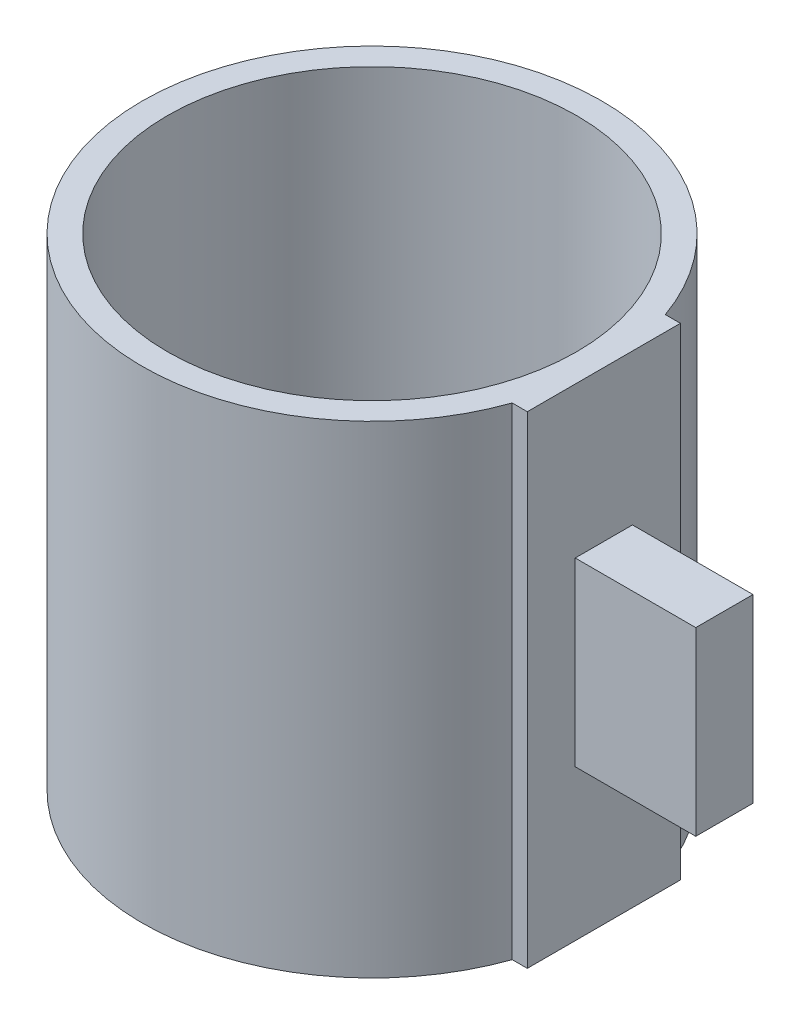
ISO-10303-21;
HEADER;
FILE_DESCRIPTION(('STEP AP214'),'2;1');
FILE_NAME('part.step','',(''),(''),'','','');
FILE_SCHEMA(('AUTOMOTIVE_DESIGN { 1 0 10303 214 1 1 1 1 }'));
ENDSEC;
DATA;
#1=APPLICATION_CONTEXT('core data for automotive mechanical design processes');
#2=APPLICATION_PROTOCOL_DEFINITION('international standard','automotive_design',2000,#1);
#3=PRODUCT_CONTEXT('',#1,'mechanical');
#4=PRODUCT('Part','Part','',(#3));
#5=PRODUCT_RELATED_PRODUCT_CATEGORY('part','',(#4));
#6=PRODUCT_DEFINITION_FORMATION('','',#4);
#7=PRODUCT_DEFINITION_CONTEXT('part definition',#1,'design');
#8=PRODUCT_DEFINITION('design','',#6,#7);
#9=PRODUCT_DEFINITION_SHAPE('','',#8);
#10=(LENGTH_UNIT() NAMED_UNIT(*) SI_UNIT(.MILLI.,.METRE.));
#11=(NAMED_UNIT(*) PLANE_ANGLE_UNIT() SI_UNIT($,.RADIAN.));
#12=(NAMED_UNIT(*) SI_UNIT($,.STERADIAN.) SOLID_ANGLE_UNIT());
#13=UNCERTAINTY_MEASURE_WITH_UNIT(LENGTH_MEASURE(1.E-05),#10,'distance_accuracy_value','');
#14=(GEOMETRIC_REPRESENTATION_CONTEXT(3) GLOBAL_UNCERTAINTY_ASSIGNED_CONTEXT((#13)) GLOBAL_UNIT_ASSIGNED_CONTEXT((#10,
#11,#12)) REPRESENTATION_CONTEXT('',''));
#15=CARTESIAN_POINT('',(0.,0.,0.));
#16=DIRECTION('',(0.,0.,1.));
#17=DIRECTION('',(1.,0.,0.));
#18=AXIS2_PLACEMENT_3D('',#15,#16,#17);
#19=CARTESIAN_POINT('',(38.4634481105469,80.,12.7));
#20=DIRECTION('',(-1.,0.,0.));
#21=DIRECTION('',(0.,0.,1.));
#22=AXIS2_PLACEMENT_3D('',#19,#20,#21);
#23=PLANE('',#22);
#24=DIRECTION('',(0.,0.,-1.));
#25=VECTOR('',#24,1.);
#26=CARTESIAN_POINT('',(38.4634481105469,0.,12.7));
#27=LINE('',#26,#25);
#28=CARTESIAN_POINT('',(38.4634481105469,0.,12.7));
#29=VERTEX_POINT('',#28);
#30=CARTESIAN_POINT('',(38.4634481105469,0.,-12.7));
#31=VERTEX_POINT('',#30);
#32=EDGE_CURVE('E151',#29,#31,#27,.T.);
#33=ORIENTED_EDGE('',*,*,#32,.T.);
#34=DIRECTION('',(0.,-1.,0.));
#35=VECTOR('',#34,1.);
#36=CARTESIAN_POINT('',(38.4634481105469,80.,-12.7));
#37=LINE('',#36,#35);
#38=CARTESIAN_POINT('',(38.4634481105469,80.,-12.7));
#39=VERTEX_POINT('',#38);
#40=EDGE_CURVE('E156',#39,#31,#37,.T.);
#41=ORIENTED_EDGE('',*,*,#40,.F.);
#42=DIRECTION('',(0.,0.,-1.));
#43=VECTOR('',#42,1.);
#44=CARTESIAN_POINT('',(38.4634481105469,80.,12.7));
#45=LINE('',#44,#43);
#46=CARTESIAN_POINT('',(38.4634481105469,80.,12.7));
#47=VERTEX_POINT('',#46);
#48=EDGE_CURVE('E142',#47,#39,#45,.T.);
#49=ORIENTED_EDGE('',*,*,#48,.F.);
#50=DIRECTION('',(0.,-1.,0.));
#51=VECTOR('',#50,1.);
#52=CARTESIAN_POINT('',(38.4634481105469,80.,12.7));
#53=LINE('',#52,#51);
#54=EDGE_CURVE('E47',#47,#29,#53,.T.);
#55=ORIENTED_EDGE('',*,*,#54,.T.);
#56=EDGE_LOOP('',(#33,#41,#49,#55));
#57=FACE_BOUND('',#56,.T.);
#58=DIRECTION('',(0.,1.,0.));
#59=VECTOR('',#58,1.);
#60=CARTESIAN_POINT('',(38.4634481105469,25.,-4.75));
#61=LINE('',#60,#59);
#62=CARTESIAN_POINT('',(38.4634481105469,25.,-4.75));
#63=VERTEX_POINT('',#62);
#64=CARTESIAN_POINT('',(38.4634481105469,55.,-4.75));
#65=VERTEX_POINT('',#64);
#66=EDGE_CURVE('E54',#63,#65,#61,.T.);
#67=ORIENTED_EDGE('',*,*,#66,.F.);
#68=DIRECTION('',(0.,0.,-1.));
#69=VECTOR('',#68,1.);
#70=CARTESIAN_POINT('',(38.4634481105469,25.,4.75));
#71=LINE('',#70,#69);
#72=CARTESIAN_POINT('',(38.4634481105469,25.,4.75));
#73=VERTEX_POINT('',#72);
#74=EDGE_CURVE('E58',#73,#63,#71,.T.);
#75=ORIENTED_EDGE('',*,*,#74,.F.);
#76=DIRECTION('',(0.,-1.,0.));
#77=VECTOR('',#76,1.);
#78=CARTESIAN_POINT('',(38.4634481105469,25.,4.75));
#79=LINE('',#78,#77);
#80=CARTESIAN_POINT('',(38.4634481105469,55.,4.75));
#81=VERTEX_POINT('',#80);
#82=EDGE_CURVE('E284',#81,#73,#79,.T.);
#83=ORIENTED_EDGE('',*,*,#82,.F.);
#84=DIRECTION('',(0.,0.,1.));
#85=VECTOR('',#84,1.);
#86=CARTESIAN_POINT('',(38.4634481105469,55.,4.75));
#87=LINE('',#86,#85);
#88=EDGE_CURVE('E290',#65,#81,#87,.T.);
#89=ORIENTED_EDGE('',*,*,#88,.F.);
#90=EDGE_LOOP('',(#67,#75,#83,#89));
#91=FACE_BOUND('',#90,.T.);
#92=ADVANCED_FACE('F39',(#57,#91),#23,.F.);
#93=CARTESIAN_POINT('',(0.,80.,0.));
#94=DIRECTION('',(0.,1.,0.));
#95=DIRECTION('',(0.,0.,1.));
#96=AXIS2_PLACEMENT_3D('',#93,#94,#95);
#97=PLANE('',#96);
#98=CARTESIAN_POINT('',(0.,80.,0.));
#99=DIRECTION('',(0.,1.,0.));
#100=DIRECTION('',(0.,0.,1.));
#101=AXIS2_PLACEMENT_3D('',#98,#99,#100);
#102=CIRCLE('',#101,38.14);
#103=CARTESIAN_POINT('',(35.9634481105469,80.,-12.7));
#104=VERTEX_POINT('',#103);
#105=CARTESIAN_POINT('',(35.9634481105469,80.,12.7));
#106=VERTEX_POINT('',#105);
#107=EDGE_CURVE('E136',#104,#106,#102,.T.);
#108=ORIENTED_EDGE('',*,*,#107,.T.);
#109=DIRECTION('',(1.,0.,0.));
#110=VECTOR('',#109,1.);
#111=CARTESIAN_POINT('',(35.9634481105469,80.,12.7));
#112=LINE('',#111,#110);
#113=EDGE_CURVE('E139',#106,#47,#112,.T.);
#114=ORIENTED_EDGE('',*,*,#113,.T.);
#115=ORIENTED_EDGE('',*,*,#48,.T.);
#116=DIRECTION('',(-1.,0.,0.));
#117=VECTOR('',#116,1.);
#118=CARTESIAN_POINT('',(35.9634481105469,80.,-12.7));
#119=LINE('',#118,#117);
#120=EDGE_CURVE('E144',#39,#104,#119,.T.);
#121=ORIENTED_EDGE('',*,*,#120,.T.);
#122=EDGE_LOOP('',(#108,#114,#115,#121));
#123=FACE_BOUND('',#122,.T.);
#124=CARTESIAN_POINT('',(0.,80.,0.));
#125=DIRECTION('',(0.,1.,0.));
#126=DIRECTION('',(0.,0.,1.));
#127=AXIS2_PLACEMENT_3D('',#124,#125,#126);
#128=CIRCLE('',#127,33.95);
#129=CARTESIAN_POINT('',(0.,80.,33.95));
#130=VERTEX_POINT('',#129);
#131=EDGE_CURVE('E127',#130,#130,#128,.T.);
#132=ORIENTED_EDGE('',*,*,#131,.F.);
#133=EDGE_LOOP('',(#132));
#134=FACE_BOUND('',#133,.T.);
#135=ADVANCED_FACE('F178',(#123,#134),#97,.T.);
#136=CARTESIAN_POINT('',(0.,0.,0.));
#137=DIRECTION('',(0.,1.,0.));
#138=DIRECTION('',(0.,0.,1.));
#139=AXIS2_PLACEMENT_3D('',#136,#137,#138);
#140=PLANE('',#139);
#141=CARTESIAN_POINT('',(0.,0.,0.));
#142=DIRECTION('',(0.,1.,0.));
#143=DIRECTION('',(0.,0.,1.));
#144=AXIS2_PLACEMENT_3D('',#141,#142,#143);
#145=CIRCLE('',#144,38.14);
#146=CARTESIAN_POINT('',(35.9634481105469,0.,-12.7));
#147=VERTEX_POINT('',#146);
#148=CARTESIAN_POINT('',(35.9634481105469,0.,12.7));
#149=VERTEX_POINT('',#148);
#150=EDGE_CURVE('E134',#147,#149,#145,.T.);
#151=ORIENTED_EDGE('',*,*,#150,.F.);
#152=DIRECTION('',(-1.,0.,0.));
#153=VECTOR('',#152,1.);
#154=CARTESIAN_POINT('',(35.9634481105469,0.,-12.7));
#155=LINE('',#154,#153);
#156=EDGE_CURVE('E140',#31,#147,#155,.T.);
#157=ORIENTED_EDGE('',*,*,#156,.F.);
#158=ORIENTED_EDGE('',*,*,#32,.F.);
#159=DIRECTION('',(1.,0.,0.));
#160=VECTOR('',#159,1.);
#161=CARTESIAN_POINT('',(35.9634481105469,0.,12.7));
#162=LINE('',#161,#160);
#163=EDGE_CURVE('E149',#149,#29,#162,.T.);
#164=ORIENTED_EDGE('',*,*,#163,.F.);
#165=EDGE_LOOP('',(#151,#157,#158,#164));
#166=FACE_BOUND('',#165,.T.);
#167=CARTESIAN_POINT('',(0.,0.,0.));
#168=DIRECTION('',(0.,1.,0.));
#169=DIRECTION('',(0.,0.,1.));
#170=AXIS2_PLACEMENT_3D('',#167,#168,#169);
#171=CIRCLE('',#170,33.95);
#172=CARTESIAN_POINT('',(0.,0.,33.95));
#173=VERTEX_POINT('',#172);
#174=EDGE_CURVE('E124',#173,#173,#171,.T.);
#175=ORIENTED_EDGE('',*,*,#174,.T.);
#176=EDGE_LOOP('',(#175));
#177=FACE_BOUND('',#176,.T.);
#178=ADVANCED_FACE('F168',(#166,#177),#140,.F.);
#179=CARTESIAN_POINT('',(0.,80.,0.));
#180=DIRECTION('',(0.,-1.,0.));
#181=DIRECTION('',(0.,0.,-1.));
#182=AXIS2_PLACEMENT_3D('',#179,#180,#181);
#183=CYLINDRICAL_SURFACE('',#182,38.14);
#184=ORIENTED_EDGE('',*,*,#150,.T.);
#185=DIRECTION('',(0.,-1.,0.));
#186=VECTOR('',#185,1.);
#187=CARTESIAN_POINT('',(35.9634481105469,80.,12.7));
#188=LINE('',#187,#186);
#189=EDGE_CURVE('E11',#106,#149,#188,.T.);
#190=ORIENTED_EDGE('',*,*,#189,.F.);
#191=ORIENTED_EDGE('',*,*,#107,.F.);
#192=DIRECTION('',(0.,-1.,0.));
#193=VECTOR('',#192,1.);
#194=CARTESIAN_POINT('',(35.9634481105469,80.,-12.7));
#195=LINE('',#194,#193);
#196=EDGE_CURVE('E146',#104,#147,#195,.T.);
#197=ORIENTED_EDGE('',*,*,#196,.T.);
#198=EDGE_LOOP('',(#184,#190,#191,#197));
#199=FACE_BOUND('',#198,.T.);
#200=ADVANCED_FACE('F41',(#199),#183,.T.);
#201=CARTESIAN_POINT('',(35.9634481105469,80.,12.7));
#202=DIRECTION('',(0.,0.,-1.));
#203=DIRECTION('',(-1.,0.,0.));
#204=AXIS2_PLACEMENT_3D('',#201,#202,#203);
#205=PLANE('',#204);
#206=ORIENTED_EDGE('',*,*,#163,.T.);
#207=ORIENTED_EDGE('',*,*,#54,.F.);
#208=ORIENTED_EDGE('',*,*,#113,.F.);
#209=ORIENTED_EDGE('',*,*,#189,.T.);
#210=EDGE_LOOP('',(#206,#207,#208,#209));
#211=FACE_BOUND('',#210,.T.);
#212=ADVANCED_FACE('F180',(#211),#205,.F.);
#213=CARTESIAN_POINT('',(35.9634481105469,80.,-12.7));
#214=DIRECTION('',(0.,0.,1.));
#215=DIRECTION('',(1.,0.,0.));
#216=AXIS2_PLACEMENT_3D('',#213,#214,#215);
#217=PLANE('',#216);
#218=ORIENTED_EDGE('',*,*,#156,.T.);
#219=ORIENTED_EDGE('',*,*,#196,.F.);
#220=ORIENTED_EDGE('',*,*,#120,.F.);
#221=ORIENTED_EDGE('',*,*,#40,.T.);
#222=EDGE_LOOP('',(#218,#219,#220,#221));
#223=FACE_BOUND('',#222,.T.);
#224=ADVANCED_FACE('F172',(#223),#217,.F.);
#225=CARTESIAN_POINT('',(0.,80.,0.));
#226=DIRECTION('',(0.,-1.,0.));
#227=DIRECTION('',(0.,0.,-1.));
#228=AXIS2_PLACEMENT_3D('',#225,#226,#227);
#229=CYLINDRICAL_SURFACE('',#228,33.95);
#230=ORIENTED_EDGE('',*,*,#131,.T.);
#231=EDGE_LOOP('',(#230));
#232=FACE_BOUND('',#231,.T.);
#233=ORIENTED_EDGE('',*,*,#174,.F.);
#234=EDGE_LOOP('',(#233));
#235=FACE_BOUND('',#234,.T.);
#236=ADVANCED_FACE('F186',(#232,#235),#229,.F.);
#237=CARTESIAN_POINT('',(58.4634481105469,25.,-4.75));
#238=DIRECTION('',(0.,0.,1.));
#239=DIRECTION('',(1.,0.,0.));
#240=AXIS2_PLACEMENT_3D('',#237,#238,#239);
#241=PLANE('',#240);
#242=ORIENTED_EDGE('',*,*,#66,.T.);
#243=DIRECTION('',(-1.,0.,0.));
#244=VECTOR('',#243,1.);
#245=CARTESIAN_POINT('',(58.4634481105469,55.,-4.75));
#246=LINE('',#245,#244);
#247=CARTESIAN_POINT('',(58.4634481105469,55.,-4.75));
#248=VERTEX_POINT('',#247);
#249=EDGE_CURVE('E107',#248,#65,#246,.T.);
#250=ORIENTED_EDGE('',*,*,#249,.F.);
#251=DIRECTION('',(0.,1.,0.));
#252=VECTOR('',#251,1.);
#253=CARTESIAN_POINT('',(58.4634481105469,25.,-4.75));
#254=LINE('',#253,#252);
#255=CARTESIAN_POINT('',(58.4634481105469,25.,-4.75));
#256=VERTEX_POINT('',#255);
#257=EDGE_CURVE('E113',#256,#248,#254,.T.);
#258=ORIENTED_EDGE('',*,*,#257,.F.);
#259=DIRECTION('',(-1.,0.,0.));
#260=VECTOR('',#259,1.);
#261=CARTESIAN_POINT('',(58.4634481105469,25.,-4.75));
#262=LINE('',#261,#260);
#263=EDGE_CURVE('E282',#256,#63,#262,.T.);
#264=ORIENTED_EDGE('',*,*,#263,.T.);
#265=EDGE_LOOP('',(#242,#250,#258,#264));
#266=FACE_BOUND('',#265,.T.);
#267=ADVANCED_FACE('F123',(#266),#241,.F.);
#268=CARTESIAN_POINT('',(58.4634481105469,55.,4.75));
#269=DIRECTION('',(0.,-1.,0.));
#270=DIRECTION('',(0.,0.,-1.));
#271=AXIS2_PLACEMENT_3D('',#268,#269,#270);
#272=PLANE('',#271);
#273=ORIENTED_EDGE('',*,*,#88,.T.);
#274=DIRECTION('',(-1.,0.,0.));
#275=VECTOR('',#274,1.);
#276=CARTESIAN_POINT('',(58.4634481105469,55.,4.75));
#277=LINE('',#276,#275);
#278=CARTESIAN_POINT('',(58.4634481105469,55.,4.75));
#279=VERTEX_POINT('',#278);
#280=EDGE_CURVE('E109',#279,#81,#277,.T.);
#281=ORIENTED_EDGE('',*,*,#280,.F.);
#282=DIRECTION('',(0.,0.,1.));
#283=VECTOR('',#282,1.);
#284=CARTESIAN_POINT('',(58.4634481105469,55.,4.75));
#285=LINE('',#284,#283);
#286=EDGE_CURVE('E102',#248,#279,#285,.T.);
#287=ORIENTED_EDGE('',*,*,#286,.F.);
#288=ORIENTED_EDGE('',*,*,#249,.T.);
#289=EDGE_LOOP('',(#273,#281,#287,#288));
#290=FACE_BOUND('',#289,.T.);
#291=ADVANCED_FACE('F105',(#290),#272,.F.);
#292=CARTESIAN_POINT('',(58.4634481105469,25.,4.75));
#293=DIRECTION('',(0.,0.,-1.));
#294=DIRECTION('',(-1.,0.,0.));
#295=AXIS2_PLACEMENT_3D('',#292,#293,#294);
#296=PLANE('',#295);
#297=ORIENTED_EDGE('',*,*,#82,.T.);
#298=DIRECTION('',(-1.,0.,0.));
#299=VECTOR('',#298,1.);
#300=CARTESIAN_POINT('',(58.4634481105469,25.,4.75));
#301=LINE('',#300,#299);
#302=CARTESIAN_POINT('',(58.4634481105469,25.,4.75));
#303=VERTEX_POINT('',#302);
#304=EDGE_CURVE('E129',#303,#73,#301,.T.);
#305=ORIENTED_EDGE('',*,*,#304,.F.);
#306=DIRECTION('',(0.,-1.,0.));
#307=VECTOR('',#306,1.);
#308=CARTESIAN_POINT('',(58.4634481105469,25.,4.75));
#309=LINE('',#308,#307);
#310=EDGE_CURVE('E112',#279,#303,#309,.T.);
#311=ORIENTED_EDGE('',*,*,#310,.F.);
#312=ORIENTED_EDGE('',*,*,#280,.T.);
#313=EDGE_LOOP('',(#297,#305,#311,#312));
#314=FACE_BOUND('',#313,.T.);
#315=ADVANCED_FACE('F204',(#314),#296,.F.);
#316=CARTESIAN_POINT('',(58.4634481105469,25.,4.75));
#317=DIRECTION('',(0.,1.,0.));
#318=DIRECTION('',(0.,0.,1.));
#319=AXIS2_PLACEMENT_3D('',#316,#317,#318);
#320=PLANE('',#319);
#321=ORIENTED_EDGE('',*,*,#74,.T.);
#322=ORIENTED_EDGE('',*,*,#263,.F.);
#323=DIRECTION('',(0.,0.,-1.));
#324=VECTOR('',#323,1.);
#325=CARTESIAN_POINT('',(58.4634481105469,25.,4.75));
#326=LINE('',#325,#324);
#327=EDGE_CURVE('E118',#303,#256,#326,.T.);
#328=ORIENTED_EDGE('',*,*,#327,.F.);
#329=ORIENTED_EDGE('',*,*,#304,.T.);
#330=EDGE_LOOP('',(#321,#322,#328,#329));
#331=FACE_BOUND('',#330,.T.);
#332=ADVANCED_FACE('F207',(#331),#320,.F.);
#333=CARTESIAN_POINT('',(58.4634481105469,0.,0.));
#334=DIRECTION('',(-1.,0.,0.));
#335=DIRECTION('',(0.,0.,1.));
#336=AXIS2_PLACEMENT_3D('',#333,#334,#335);
#337=PLANE('',#336);
#338=ORIENTED_EDGE('',*,*,#257,.T.);
#339=ORIENTED_EDGE('',*,*,#286,.T.);
#340=ORIENTED_EDGE('',*,*,#310,.T.);
#341=ORIENTED_EDGE('',*,*,#327,.T.);
#342=EDGE_LOOP('',(#338,#339,#340,#341));
#343=FACE_BOUND('',#342,.T.);
#344=ADVANCED_FACE('F116',(#343),#337,.F.);
#345=CLOSED_SHELL('',(#92,#135,#178,#200,#212,#224,#236,#267,#291,#315,#332,#344));
#346=MANIFOLD_SOLID_BREP('B2',#345);
#347=ADVANCED_BREP_SHAPE_REPRESENTATION('',(#18,#346),#14);
#348=SHAPE_DEFINITION_REPRESENTATION(#9,#347);
ENDSEC;
END-ISO-10303-21;
